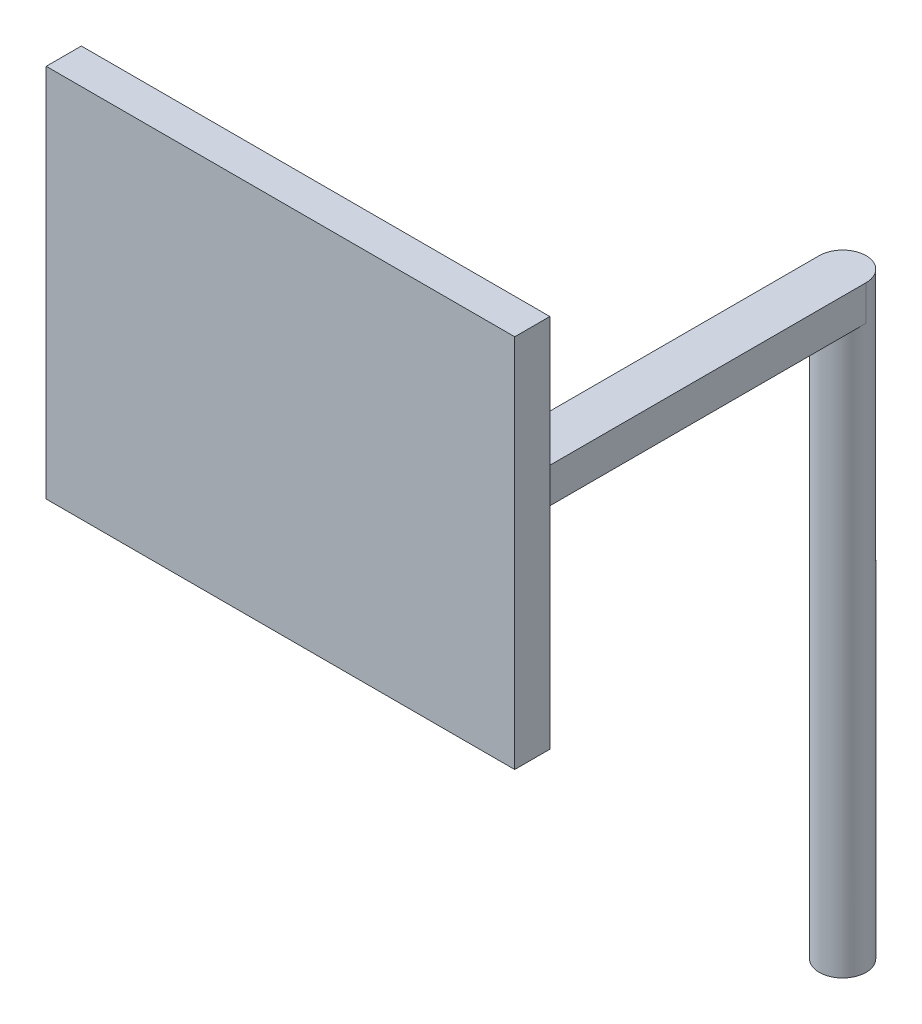
ISO-10303-21;
HEADER;
FILE_DESCRIPTION(('STEP AP214'),'2;1');
FILE_NAME('part.step','',(''),(''),'','','');
FILE_SCHEMA(('AUTOMOTIVE_DESIGN { 1 0 10303 214 1 1 1 1 }'));
ENDSEC;
DATA;
#1=APPLICATION_CONTEXT('core data for automotive mechanical design processes');
#2=APPLICATION_PROTOCOL_DEFINITION('international standard','automotive_design',2000,#1);
#3=PRODUCT_CONTEXT('',#1,'mechanical');
#4=PRODUCT('Part','Part','',(#3));
#5=PRODUCT_RELATED_PRODUCT_CATEGORY('part','',(#4));
#6=PRODUCT_DEFINITION_FORMATION('','',#4);
#7=PRODUCT_DEFINITION_CONTEXT('part definition',#1,'design');
#8=PRODUCT_DEFINITION('design','',#6,#7);
#9=PRODUCT_DEFINITION_SHAPE('','',#8);
#10=(LENGTH_UNIT() NAMED_UNIT(*) SI_UNIT(.MILLI.,.METRE.));
#11=(NAMED_UNIT(*) PLANE_ANGLE_UNIT() SI_UNIT($,.RADIAN.));
#12=(NAMED_UNIT(*) SI_UNIT($,.STERADIAN.) SOLID_ANGLE_UNIT());
#13=UNCERTAINTY_MEASURE_WITH_UNIT(LENGTH_MEASURE(1.E-05),#10,'distance_accuracy_value','');
#14=(GEOMETRIC_REPRESENTATION_CONTEXT(3) GLOBAL_UNCERTAINTY_ASSIGNED_CONTEXT((#13)) GLOBAL_UNIT_ASSIGNED_CONTEXT((#10,
#11,#12)) REPRESENTATION_CONTEXT('',''));
#15=CARTESIAN_POINT('',(0.,0.,0.));
#16=DIRECTION('',(0.,0.,1.));
#17=DIRECTION('',(1.,0.,0.));
#18=AXIS2_PLACEMENT_3D('',#15,#16,#17);
#19=CARTESIAN_POINT('',(0.,120.,0.));
#20=DIRECTION('',(0.,-1.,0.));
#21=DIRECTION('',(0.,0.,-1.));
#22=AXIS2_PLACEMENT_3D('',#19,#20,#21);
#23=CYLINDRICAL_SURFACE('',#22,5.);
#24=CARTESIAN_POINT('',(0.,120.,0.));
#25=DIRECTION('',(0.,1.,0.));
#26=DIRECTION('',(0.,0.,1.));
#27=AXIS2_PLACEMENT_3D('',#24,#25,#26);
#28=CIRCLE('',#27,5.);
#29=CARTESIAN_POINT('',(-5.,120.,0.));
#30=VERTEX_POINT('',#29);
#31=CARTESIAN_POINT('',(5.,120.,0.));
#32=VERTEX_POINT('',#31);
#33=EDGE_CURVE('E57',#30,#32,#28,.T.);
#34=ORIENTED_EDGE('',*,*,#33,.F.);
#35=DIRECTION('',(0.,-1.,0.));
#36=VECTOR('',#35,1.);
#37=CARTESIAN_POINT('',(-5.,127.5,0.));
#38=LINE('',#37,#36);
#39=CARTESIAN_POINT('',(-5.,127.5,0.));
#40=VERTEX_POINT('',#39);
#41=EDGE_CURVE('E196',#40,#30,#38,.T.);
#42=ORIENTED_EDGE('',*,*,#41,.F.);
#43=CARTESIAN_POINT('',(0.,127.5,0.));
#44=DIRECTION('',(0.,1.,0.));
#45=DIRECTION('',(0.,0.,1.));
#46=AXIS2_PLACEMENT_3D('',#43,#44,#45);
#47=CIRCLE('',#46,5.);
#48=CARTESIAN_POINT('',(5.,127.5,0.));
#49=VERTEX_POINT('',#48);
#50=EDGE_CURVE('E174',#49,#40,#47,.T.);
#51=ORIENTED_EDGE('',*,*,#50,.F.);
#52=DIRECTION('',(0.,-1.,0.));
#53=VECTOR('',#52,1.);
#54=CARTESIAN_POINT('',(5.,127.5,0.));
#55=LINE('',#54,#53);
#56=EDGE_CURVE('E186',#49,#32,#55,.T.);
#57=ORIENTED_EDGE('',*,*,#56,.T.);
#58=EDGE_LOOP('',(#34,#42,#51,#57));
#59=FACE_BOUND('',#58,.T.);
#60=CARTESIAN_POINT('',(0.,0.,0.));
#61=DIRECTION('',(0.,1.,0.));
#62=DIRECTION('',(0.,0.,1.));
#63=AXIS2_PLACEMENT_3D('',#60,#61,#62);
#64=CIRCLE('',#63,5.);
#65=CARTESIAN_POINT('',(0.,0.,5.));
#66=VERTEX_POINT('',#65);
#67=EDGE_CURVE('E199',#66,#66,#64,.T.);
#68=ORIENTED_EDGE('',*,*,#67,.T.);
#69=EDGE_LOOP('',(#68));
#70=FACE_BOUND('',#69,.T.);
#71=ADVANCED_FACE('F49',(#59,#70),#23,.T.);
#72=CARTESIAN_POINT('',(0.,0.,0.));
#73=DIRECTION('',(0.,1.,0.));
#74=DIRECTION('',(0.,0.,1.));
#75=AXIS2_PLACEMENT_3D('',#72,#73,#74);
#76=PLANE('',#75);
#77=ORIENTED_EDGE('',*,*,#67,.F.);
#78=EDGE_LOOP('',(#77));
#79=FACE_BOUND('',#78,.T.);
#80=ADVANCED_FACE('F207',(#79),#76,.F.);
#81=CARTESIAN_POINT('',(0.,120.,0.));
#82=DIRECTION('',(0.,1.,0.));
#83=DIRECTION('',(0.,0.,1.));
#84=AXIS2_PLACEMENT_3D('',#81,#82,#83);
#85=PLANE('',#84);
#86=DIRECTION('',(0.,0.,-1.));
#87=VECTOR('',#86,1.);
#88=CARTESIAN_POINT('',(5.,120.,0.));
#89=LINE('',#88,#87);
#90=CARTESIAN_POINT('',(5.00000000000001,120.,112.5));
#91=VERTEX_POINT('',#90);
#92=EDGE_CURVE('E179',#91,#32,#89,.T.);
#93=ORIENTED_EDGE('',*,*,#92,.F.);
#94=DIRECTION('',(1.,0.,0.));
#95=VECTOR('',#94,1.);
#96=CARTESIAN_POINT('',(50.,120.,112.5));
#97=LINE('',#96,#95);
#98=CARTESIAN_POINT('',(50.,120.,112.5));
#99=VERTEX_POINT('',#98);
#100=EDGE_CURVE('E139',#91,#99,#97,.T.);
#101=ORIENTED_EDGE('',*,*,#100,.T.);
#102=DIRECTION('',(0.,0.,1.));
#103=VECTOR('',#102,1.);
#104=CARTESIAN_POINT('',(50.,120.,112.5));
#105=LINE('',#104,#103);
#106=CARTESIAN_POINT('',(50.,120.,120.));
#107=VERTEX_POINT('',#106);
#108=EDGE_CURVE('E127',#99,#107,#105,.T.);
#109=ORIENTED_EDGE('',*,*,#108,.T.);
#110=DIRECTION('',(1.,0.,0.));
#111=VECTOR('',#110,1.);
#112=CARTESIAN_POINT('',(-4.99999999999999,120.,120.));
#113=LINE('',#112,#111);
#114=CARTESIAN_POINT('',(-50.,120.,120.));
#115=VERTEX_POINT('',#114);
#116=EDGE_CURVE('E121',#115,#107,#113,.T.);
#117=ORIENTED_EDGE('',*,*,#116,.F.);
#118=DIRECTION('',(0.,0.,1.));
#119=VECTOR('',#118,1.);
#120=CARTESIAN_POINT('',(-50.,120.,112.5));
#121=LINE('',#120,#119);
#122=CARTESIAN_POINT('',(-50.,120.,112.5));
#123=VERTEX_POINT('',#122);
#124=EDGE_CURVE('E116',#123,#115,#121,.T.);
#125=ORIENTED_EDGE('',*,*,#124,.F.);
#126=CARTESIAN_POINT('',(-4.99999999999999,120.,112.5));
#127=VERTEX_POINT('',#126);
#128=EDGE_CURVE('E119',#123,#127,#97,.T.);
#129=ORIENTED_EDGE('',*,*,#128,.T.);
#130=DIRECTION('',(0.,0.,1.));
#131=VECTOR('',#130,1.);
#132=CARTESIAN_POINT('',(-5.,120.,0.));
#133=LINE('',#132,#131);
#134=EDGE_CURVE('E64',#30,#127,#133,.T.);
#135=ORIENTED_EDGE('',*,*,#134,.F.);
#136=ORIENTED_EDGE('',*,*,#33,.T.);
#137=EDGE_LOOP('',(#93,#101,#109,#117,#125,#129,#135,#136));
#138=FACE_BOUND('',#137,.T.);
#139=ADVANCED_FACE('F118',(#138),#85,.F.);
#140=CARTESIAN_POINT('',(-5.,127.5,0.));
#141=DIRECTION('',(1.,0.,0.));
#142=DIRECTION('',(0.,0.,-1.));
#143=AXIS2_PLACEMENT_3D('',#140,#141,#142);
#144=PLANE('',#143);
#145=ORIENTED_EDGE('',*,*,#134,.T.);
#146=DIRECTION('',(0.,1.,0.));
#147=VECTOR('',#146,1.);
#148=CARTESIAN_POINT('',(-4.99999999999999,127.5,112.5));
#149=LINE('',#148,#147);
#150=CARTESIAN_POINT('',(-4.99999999999999,127.5,112.5));
#151=VERTEX_POINT('',#150);
#152=EDGE_CURVE('E136',#127,#151,#149,.T.);
#153=ORIENTED_EDGE('',*,*,#152,.T.);
#154=DIRECTION('',(0.,0.,1.));
#155=VECTOR('',#154,1.);
#156=CARTESIAN_POINT('',(-5.,127.5,0.));
#157=LINE('',#156,#155);
#158=EDGE_CURVE('E178',#40,#151,#157,.T.);
#159=ORIENTED_EDGE('',*,*,#158,.F.);
#160=ORIENTED_EDGE('',*,*,#41,.T.);
#161=EDGE_LOOP('',(#145,#153,#159,#160));
#162=FACE_BOUND('',#161,.T.);
#163=ADVANCED_FACE('F213',(#162),#144,.F.);
#164=CARTESIAN_POINT('',(-4.99999999999999,127.5,120.));
#165=DIRECTION('',(0.,0.,-1.));
#166=DIRECTION('',(-1.,0.,0.));
#167=AXIS2_PLACEMENT_3D('',#164,#165,#166);
#168=PLANE('',#167);
#169=DIRECTION('',(0.,-1.,0.));
#170=VECTOR('',#169,1.);
#171=CARTESIAN_POINT('',(-50.,120.,120.));
#172=LINE('',#171,#170);
#173=CARTESIAN_POINT('',(-50.,200.,120.));
#174=VERTEX_POINT('',#173);
#175=EDGE_CURVE('E157',#174,#115,#172,.T.);
#176=ORIENTED_EDGE('',*,*,#175,.T.);
#177=ORIENTED_EDGE('',*,*,#116,.T.);
#178=DIRECTION('',(0.,1.,0.));
#179=VECTOR('',#178,1.);
#180=CARTESIAN_POINT('',(50.,120.,120.));
#181=LINE('',#180,#179);
#182=CARTESIAN_POINT('',(50.,200.,120.));
#183=VERTEX_POINT('',#182);
#184=EDGE_CURVE('E149',#107,#183,#181,.T.);
#185=ORIENTED_EDGE('',*,*,#184,.T.);
#186=DIRECTION('',(-1.,0.,0.));
#187=VECTOR('',#186,1.);
#188=CARTESIAN_POINT('',(-50.,200.,120.));
#189=LINE('',#188,#187);
#190=EDGE_CURVE('E144',#183,#174,#189,.T.);
#191=ORIENTED_EDGE('',*,*,#190,.T.);
#192=EDGE_LOOP('',(#176,#177,#185,#191));
#193=FACE_BOUND('',#192,.T.);
#194=ADVANCED_FACE('F219',(#193),#168,.F.);
#195=CARTESIAN_POINT('',(5.,127.5,0.));
#196=DIRECTION('',(-1.,0.,0.));
#197=DIRECTION('',(0.,0.,1.));
#198=AXIS2_PLACEMENT_3D('',#195,#196,#197);
#199=PLANE('',#198);
#200=DIRECTION('',(0.,0.,-1.));
#201=VECTOR('',#200,1.);
#202=CARTESIAN_POINT('',(5.,127.5,0.));
#203=LINE('',#202,#201);
#204=CARTESIAN_POINT('',(5.00000000000001,127.5,112.5));
#205=VERTEX_POINT('',#204);
#206=EDGE_CURVE('E183',#205,#49,#203,.T.);
#207=ORIENTED_EDGE('',*,*,#206,.F.);
#208=DIRECTION('',(0.,-1.,0.));
#209=VECTOR('',#208,1.);
#210=CARTESIAN_POINT('',(5.00000000000001,127.5,112.5));
#211=LINE('',#210,#209);
#212=EDGE_CURVE('E72',#205,#91,#211,.T.);
#213=ORIENTED_EDGE('',*,*,#212,.T.);
#214=ORIENTED_EDGE('',*,*,#92,.T.);
#215=ORIENTED_EDGE('',*,*,#56,.F.);
#216=EDGE_LOOP('',(#207,#213,#214,#215));
#217=FACE_BOUND('',#216,.T.);
#218=ADVANCED_FACE('F222',(#217),#199,.F.);
#219=CARTESIAN_POINT('',(0.,127.5,0.));
#220=DIRECTION('',(0.,1.,0.));
#221=DIRECTION('',(0.,0.,1.));
#222=AXIS2_PLACEMENT_3D('',#219,#220,#221);
#223=PLANE('',#222);
#224=DIRECTION('',(-1.,0.,0.));
#225=VECTOR('',#224,1.);
#226=CARTESIAN_POINT('',(0.,127.5,112.5));
#227=LINE('',#226,#225);
#228=EDGE_CURVE('E11',#205,#151,#227,.T.);
#229=ORIENTED_EDGE('',*,*,#228,.F.);
#230=ORIENTED_EDGE('',*,*,#206,.T.);
#231=ORIENTED_EDGE('',*,*,#50,.T.);
#232=ORIENTED_EDGE('',*,*,#158,.T.);
#233=EDGE_LOOP('',(#229,#230,#231,#232));
#234=FACE_BOUND('',#233,.T.);
#235=ADVANCED_FACE('F225',(#234),#223,.T.);
#236=CARTESIAN_POINT('',(0.,0.,112.5));
#237=DIRECTION('',(0.,0.,-1.));
#238=DIRECTION('',(-1.,0.,0.));
#239=AXIS2_PLACEMENT_3D('',#236,#237,#238);
#240=PLANE('',#239);
#241=ORIENTED_EDGE('',*,*,#152,.F.);
#242=ORIENTED_EDGE('',*,*,#128,.F.);
#243=DIRECTION('',(0.,-1.,0.));
#244=VECTOR('',#243,1.);
#245=CARTESIAN_POINT('',(-50.,120.,112.5));
#246=LINE('',#245,#244);
#247=CARTESIAN_POINT('',(-50.,200.,112.5));
#248=VERTEX_POINT('',#247);
#249=EDGE_CURVE('E134',#248,#123,#246,.T.);
#250=ORIENTED_EDGE('',*,*,#249,.F.);
#251=DIRECTION('',(-1.,0.,0.));
#252=VECTOR('',#251,1.);
#253=CARTESIAN_POINT('',(-50.,200.,112.5));
#254=LINE('',#253,#252);
#255=CARTESIAN_POINT('',(50.,200.,112.5));
#256=VERTEX_POINT('',#255);
#257=EDGE_CURVE('E128',#256,#248,#254,.T.);
#258=ORIENTED_EDGE('',*,*,#257,.F.);
#259=DIRECTION('',(0.,1.,0.));
#260=VECTOR('',#259,1.);
#261=CARTESIAN_POINT('',(50.,120.,112.5));
#262=LINE('',#261,#260);
#263=EDGE_CURVE('E138',#99,#256,#262,.T.);
#264=ORIENTED_EDGE('',*,*,#263,.F.);
#265=ORIENTED_EDGE('',*,*,#100,.F.);
#266=ORIENTED_EDGE('',*,*,#212,.F.);
#267=ORIENTED_EDGE('',*,*,#228,.T.);
#268=EDGE_LOOP('',(#241,#242,#250,#258,#264,#265,#266,#267));
#269=FACE_BOUND('',#268,.T.);
#270=ADVANCED_FACE('F132',(#269),#240,.T.);
#271=CARTESIAN_POINT('',(-50.,120.,112.5));
#272=DIRECTION('',(-1.,0.,0.));
#273=DIRECTION('',(0.,-1.,0.));
#274=AXIS2_PLACEMENT_3D('',#271,#272,#273);
#275=PLANE('',#274);
#276=ORIENTED_EDGE('',*,*,#175,.F.);
#277=DIRECTION('',(0.,0.,1.));
#278=VECTOR('',#277,1.);
#279=CARTESIAN_POINT('',(-50.,200.,112.5));
#280=LINE('',#279,#278);
#281=EDGE_CURVE('E142',#248,#174,#280,.T.);
#282=ORIENTED_EDGE('',*,*,#281,.F.);
#283=ORIENTED_EDGE('',*,*,#249,.T.);
#284=ORIENTED_EDGE('',*,*,#124,.T.);
#285=EDGE_LOOP('',(#276,#282,#283,#284));
#286=FACE_BOUND('',#285,.T.);
#287=ADVANCED_FACE('F141',(#286),#275,.T.);
#288=CARTESIAN_POINT('',(-50.,200.,112.5));
#289=DIRECTION('',(0.,1.,0.));
#290=DIRECTION('',(0.,0.,1.));
#291=AXIS2_PLACEMENT_3D('',#288,#289,#290);
#292=PLANE('',#291);
#293=ORIENTED_EDGE('',*,*,#190,.F.);
#294=DIRECTION('',(0.,0.,1.));
#295=VECTOR('',#294,1.);
#296=CARTESIAN_POINT('',(50.,200.,112.5));
#297=LINE('',#296,#295);
#298=EDGE_CURVE('E165',#256,#183,#297,.T.);
#299=ORIENTED_EDGE('',*,*,#298,.F.);
#300=ORIENTED_EDGE('',*,*,#257,.T.);
#301=ORIENTED_EDGE('',*,*,#281,.T.);
#302=EDGE_LOOP('',(#293,#299,#300,#301));
#303=FACE_BOUND('',#302,.T.);
#304=ADVANCED_FACE('F232',(#303),#292,.T.);
#305=CARTESIAN_POINT('',(50.,120.,112.5));
#306=DIRECTION('',(1.,0.,0.));
#307=DIRECTION('',(0.,1.,0.));
#308=AXIS2_PLACEMENT_3D('',#305,#306,#307);
#309=PLANE('',#308);
#310=ORIENTED_EDGE('',*,*,#184,.F.);
#311=ORIENTED_EDGE('',*,*,#108,.F.);
#312=ORIENTED_EDGE('',*,*,#263,.T.);
#313=ORIENTED_EDGE('',*,*,#298,.T.);
#314=EDGE_LOOP('',(#310,#311,#312,#313));
#315=FACE_BOUND('',#314,.T.);
#316=ADVANCED_FACE('F233',(#315),#309,.T.);
#317=CLOSED_SHELL('',(#71,#80,#139,#163,#194,#218,#235,#270,#287,#304,#316));
#318=MANIFOLD_SOLID_BREP('B2',#317);
#319=ADVANCED_BREP_SHAPE_REPRESENTATION('',(#18,#318),#14);
#320=SHAPE_DEFINITION_REPRESENTATION(#9,#319);
ENDSEC;
END-ISO-10303-21;
